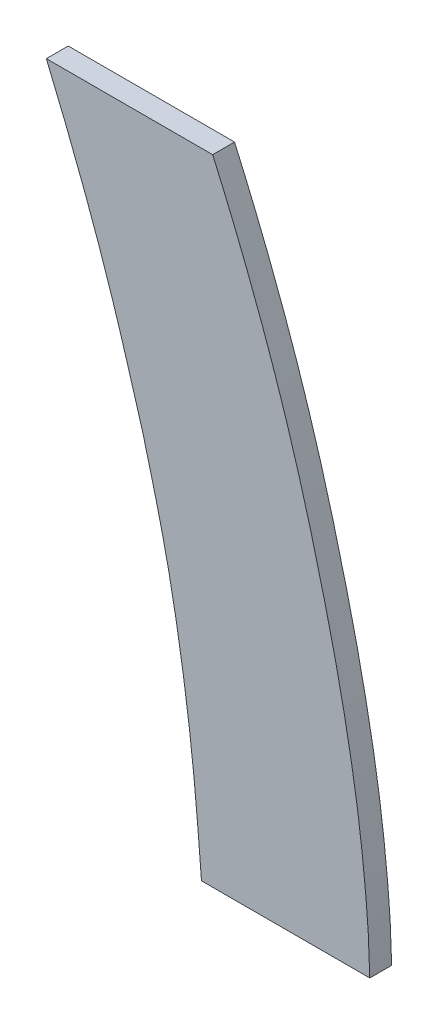
ISO-10303-21;
HEADER;
FILE_DESCRIPTION(('STEP AP214'),'2;1');
FILE_NAME('part.step','',(''),(''),'','','');
FILE_SCHEMA(('AUTOMOTIVE_DESIGN { 1 0 10303 214 1 1 1 1 }'));
ENDSEC;
DATA;
#1=APPLICATION_CONTEXT('core data for automotive mechanical design processes');
#2=APPLICATION_PROTOCOL_DEFINITION('international standard','automotive_design',2000,#1);
#3=PRODUCT_CONTEXT('',#1,'mechanical');
#4=PRODUCT('Part','Part','',(#3));
#5=PRODUCT_RELATED_PRODUCT_CATEGORY('part','',(#4));
#6=PRODUCT_DEFINITION_FORMATION('','',#4);
#7=PRODUCT_DEFINITION_CONTEXT('part definition',#1,'design');
#8=PRODUCT_DEFINITION('design','',#6,#7);
#9=PRODUCT_DEFINITION_SHAPE('','',#8);
#10=(LENGTH_UNIT() NAMED_UNIT(*) SI_UNIT(.MILLI.,.METRE.));
#11=(NAMED_UNIT(*) PLANE_ANGLE_UNIT() SI_UNIT($,.RADIAN.));
#12=(NAMED_UNIT(*) SI_UNIT($,.STERADIAN.) SOLID_ANGLE_UNIT());
#13=UNCERTAINTY_MEASURE_WITH_UNIT(LENGTH_MEASURE(1.E-05),#10,'distance_accuracy_value','');
#14=(GEOMETRIC_REPRESENTATION_CONTEXT(3) GLOBAL_UNCERTAINTY_ASSIGNED_CONTEXT((#13)) GLOBAL_UNIT_ASSIGNED_CONTEXT((#10,
#11,#12)) REPRESENTATION_CONTEXT('',''));
#15=CARTESIAN_POINT('',(0.,0.,0.));
#16=DIRECTION('',(0.,0.,1.));
#17=DIRECTION('',(1.,0.,0.));
#18=AXIS2_PLACEMENT_3D('',#15,#16,#17);
#19=CARTESIAN_POINT('',(1.15384615384617,-15.,0.5));
#20=DIRECTION('',(0.,1.,0.));
#21=DIRECTION('',(0.,0.,1.));
#22=AXIS2_PLACEMENT_3D('',#19,#20,#21);
#23=PLANE('',#22);
#24=DIRECTION('',(1.,0.,0.));
#25=VECTOR('',#24,1.);
#26=CARTESIAN_POINT('',(1.15384615384617,-15.,0.));
#27=LINE('',#26,#25);
#28=CARTESIAN_POINT('',(1.15384615384617,-15.,0.));
#29=VERTEX_POINT('',#28);
#30=CARTESIAN_POINT('',(5.00000000000002,-15.,0.));
#31=VERTEX_POINT('',#30);
#32=EDGE_CURVE('E95',#29,#31,#27,.T.);
#33=ORIENTED_EDGE('',*,*,#32,.T.);
#34=DIRECTION('',(0.,0.,-1.));
#35=VECTOR('',#34,1.);
#36=CARTESIAN_POINT('',(5.00000000000002,-15.,0.5));
#37=LINE('',#36,#35);
#38=CARTESIAN_POINT('',(5.00000000000002,-15.,0.5));
#39=VERTEX_POINT('',#38);
#40=EDGE_CURVE('E94',#39,#31,#37,.T.);
#41=ORIENTED_EDGE('',*,*,#40,.F.);
#42=DIRECTION('',(1.,0.,0.));
#43=VECTOR('',#42,1.);
#44=CARTESIAN_POINT('',(1.15384615384617,-15.,0.5));
#45=LINE('',#44,#43);
#46=CARTESIAN_POINT('',(1.15384615384617,-15.,0.5));
#47=VERTEX_POINT('',#46);
#48=EDGE_CURVE('E145',#47,#39,#45,.T.);
#49=ORIENTED_EDGE('',*,*,#48,.F.);
#50=DIRECTION('',(0.,0.,-1.));
#51=VECTOR('',#50,1.);
#52=CARTESIAN_POINT('',(1.15384615384617,-15.,0.5));
#53=LINE('',#52,#51);
#54=EDGE_CURVE('E100',#47,#29,#53,.T.);
#55=ORIENTED_EDGE('',*,*,#54,.T.);
#56=EDGE_LOOP('',(#33,#41,#49,#55));
#57=FACE_BOUND('',#56,.T.);
#58=ADVANCED_FACE('F39',(#57),#23,.F.);
#59=CARTESIAN_POINT('',(-0.174278846153829,-6.84495192307692,0.5));
#60=CARTESIAN_POINT('',(-0.00832928136429848,-7.47820090477207,0.5));
#61=CARTESIAN_POINT('',(0.329273760221203,-8.76646449601646,0.5));
#62=CARTESIAN_POINT('',(0.698845110705702,-10.7669747186921,0.5));
#63=CARTESIAN_POINT('',(0.984578563524244,-12.8528079495376,0.5));
#64=CARTESIAN_POINT('',(1.09678082774382,-14.2761153252611,0.5));
#65=CARTESIAN_POINT('',(1.15384615384617,-15.,0.5));
#66=B_SPLINE_CURVE_WITH_KNOTS('',3,(#59,#60,#61,#62,#63,#64,#65),.UNSPECIFIED.,.F.,.F.,(4,1,1,1,
4),(0.,0.23721651860421,0.482586491243136,0.736846927177931,1.),.UNSPECIFIED.);
#67=DIRECTION('',(0.,0.,-1.));
#68=VECTOR('',#67,1.);
#69=SURFACE_OF_LINEAR_EXTRUSION('',#66,#68);
#70=CARTESIAN_POINT('',(-0.174278846153829,-6.84495192307692,0.));
#71=CARTESIAN_POINT('',(-0.00832928136429848,-7.47820090477207,0.));
#72=CARTESIAN_POINT('',(0.329273760221203,-8.76646449601646,0.));
#73=CARTESIAN_POINT('',(0.698845110705702,-10.7669747186921,0.));
#74=CARTESIAN_POINT('',(0.984578563524244,-12.8528079495376,0.));
#75=CARTESIAN_POINT('',(1.09678082774382,-14.2761153252611,0.));
#76=CARTESIAN_POINT('',(1.15384615384617,-15.,0.));
#77=B_SPLINE_CURVE_WITH_KNOTS('',3,(#70,#71,#72,#73,#74,#75,#76),.UNSPECIFIED.,.F.,.F.,(4,1,1,1,
4),(0.,0.23721651860421,0.482586491243136,0.736846927177931,1.),.UNSPECIFIED.);
#78=CARTESIAN_POINT('',(-0.174278846153829,-6.84495192307692,0.));
#79=VERTEX_POINT('',#78);
#80=EDGE_CURVE('E86',#79,#29,#77,.T.);
#81=ORIENTED_EDGE('',*,*,#80,.T.);
#82=ORIENTED_EDGE('',*,*,#54,.F.);
#83=CARTESIAN_POINT('',(-0.174278846153829,-6.84495192307692,0.5));
#84=VERTEX_POINT('',#83);
#85=EDGE_CURVE('E115',#84,#47,#66,.T.);
#86=ORIENTED_EDGE('',*,*,#85,.F.);
#87=DIRECTION('',(0.,0.,-1.));
#88=VECTOR('',#87,1.);
#89=CARTESIAN_POINT('',(-0.174278846153829,-6.84495192307692,0.5));
#90=LINE('',#89,#88);
#91=EDGE_CURVE('E47',#84,#79,#90,.T.);
#92=ORIENTED_EDGE('',*,*,#91,.T.);
#93=EDGE_LOOP('',(#81,#82,#86,#92));
#94=FACE_BOUND('',#93,.T.);
#95=ADVANCED_FACE('F122',(#94),#69,.F.);
#96=CARTESIAN_POINT('',(-3.95049273409952,2.81861389838005,0.5));
#97=DIRECTION('',(0.,0.,1.));
#98=DIRECTION('',(1.,0.,0.));
#99=AXIS2_PLACEMENT_3D('',#96,#97,#98);
#100=PLANE('',#99);
#101=DIRECTION('',(1.,0.,0.));
#102=VECTOR('',#101,1.);
#103=CARTESIAN_POINT('',(-3.95049273409952,-0.5,0.5));
#104=LINE('',#103,#102);
#105=CARTESIAN_POINT('',(-2.3913306629247,-0.500000000001907,0.5));
#106=VERTEX_POINT('',#105);
#107=CARTESIAN_POINT('',(1.40940715828724,-0.5,0.5));
#108=VERTEX_POINT('',#107);
#109=EDGE_CURVE('E74',#106,#108,#104,.T.);
#110=ORIENTED_EDGE('',*,*,#109,.F.);
#111=CARTESIAN_POINT('',(-9.6153846153846,11.5024038461538,0.5));
#112=CARTESIAN_POINT('',(-9.3889882736424,11.2376522562014,0.5));
#113=CARTESIAN_POINT('',(-8.92608728055129,10.6963282534886,0.5));
#114=CARTESIAN_POINT('',(-8.25548066497366,9.83408603599883,0.5));
#115=CARTESIAN_POINT('',(-7.58138944532267,8.91609230107851,0.5));
#116=CARTESIAN_POINT('',(-6.9156621712902,7.93351961209931,0.5));
#117=CARTESIAN_POINT('',(-6.24835155024634,6.89353876319968,0.5));
#118=CARTESIAN_POINT('',(-5.5821432756538,5.79282828697568,0.5));
#119=CARTESIAN_POINT('',(-4.91431765251822,4.63406915861775,0.5));
#120=CARTESIAN_POINT('',(-4.03833035758797,3.01158053099116,0.5));
#121=CARTESIAN_POINT('',(-2.99323232642266,0.934386038558628,0.5));
#122=CARTESIAN_POINT('',(-1.90727624655536,-1.6250913851388,0.5));
#123=CARTESIAN_POINT('',(-0.943198230433538,-4.21007935595809,0.5));
#124=CARTESIAN_POINT('',(-0.430159665560484,-5.96811962402121,0.5));
#125=CARTESIAN_POINT('',(-0.174278846153829,-6.84495192307692,0.5));
#126=B_SPLINE_CURVE_WITH_KNOTS('',3,(#111,#112,#113,#114,#115,#116,#117,#118,#119,#120,#121,
#122,#123,#124,#125),.UNSPECIFIED.,.F.,.F.,(4,1,1,1,1,1,1,1,1,1,1,1,4),(0.,0.0502734726151882,
0.102791592039982,0.157614974931026,0.21463366483612,0.274064470748065,0.335948475214225,
0.400322064136752,0.467079328402037,0.602073356450051,0.7357483921365,0.868203050259254,1.),.UNSPECIFIED.);
#127=EDGE_CURVE('E108',#106,#84,#126,.T.);
#128=ORIENTED_EDGE('',*,*,#127,.T.);
#129=ORIENTED_EDGE('',*,*,#85,.T.);
#130=ORIENTED_EDGE('',*,*,#48,.T.);
#131=CARTESIAN_POINT('',(5.00000000000002,-15.,0.5));
#132=CARTESIAN_POINT('',(4.99077477249062,-14.7013651948623,0.5));
#133=CARTESIAN_POINT('',(4.97180363540864,-14.0872403052648,0.5));
#134=CARTESIAN_POINT('',(4.88791171104833,-13.1435720498954,0.5));
#135=CARTESIAN_POINT('',(4.77617535121427,-12.1530107653034,0.5));
#136=CARTESIAN_POINT('',(4.61835722386701,-11.1189027948977,0.5));
#137=CARTESIAN_POINT('',(4.41775741449406,-10.0391490017902,0.5));
#138=CARTESIAN_POINT('',(4.17871649303776,-8.91260570880092,0.5));
#139=CARTESIAN_POINT('',(3.89323169747081,-7.74160284995349,0.5));
#140=CARTESIAN_POINT('',(3.47101596671221,-6.11808420209938,0.5));
#141=CARTESIAN_POINT('',(2.84395697052078,-4.07664347203007,0.5));
#142=CARTESIAN_POINT('',(1.93100448110088,-1.66282701999771,0.5));
#143=CARTESIAN_POINT('',(0.881084437999897,0.709568284264685,0.5));
#144=CARTESIAN_POINT('',(-0.120982865143056,2.63345519191569,0.5));
#145=CARTESIAN_POINT('',(-0.975501110873675,4.13162478775536,0.5));
#146=CARTESIAN_POINT('',(-1.62396200729946,5.21866236523238,0.5));
#147=CARTESIAN_POINT('',(-2.29086299188346,6.25448879588679,0.5));
#148=CARTESIAN_POINT('',(-2.96384029314396,7.24655553228087,0.5));
#149=CARTESIAN_POINT('',(-3.64301055108902,8.19569803809813,0.5));
#150=CARTESIAN_POINT('',(-4.34220880125551,9.09304439301213,0.5));
#151=CARTESIAN_POINT('',(-5.04082027618084,9.95662220214234,0.5));
#152=CARTESIAN_POINT('',(-5.52856856197223,10.5007500523017,0.5));
#153=CARTESIAN_POINT('',(-5.76923076923075,10.7692307692308,0.5));
#154=B_SPLINE_CURVE_WITH_KNOTS('',3,(#131,#132,#133,#134,#135,#136,#137,#138,#139,#140,#141,
#142,#143,#144,#145,#146,#147,#148,#149,#150,#151,#152,#153),.UNSPECIFIED.,.F.,.F.,(4,1,1,1,1,1,
1,1,1,1,1,1,1,1,1,1,1,1,1,1,4),(0.,0.0315156437386742,0.0648100653327354,0.0999121128959951,
0.136676095020003,0.175144023715208,0.215765905895984,0.2581579823942,0.30229429684818,
0.392742479500207,0.483300472378782,0.574413865251515,0.666292469849835,0.712009554638809,
0.756373487942463,0.799814650688496,0.841961044395734,0.882842690062067,0.922917712140965,
0.961966460821911,1.),.UNSPECIFIED.);
#155=EDGE_CURVE('E107',#39,#108,#154,.T.);
#156=ORIENTED_EDGE('',*,*,#155,.T.);
#157=EDGE_LOOP('',(#110,#128,#129,#130,#156));
#158=FACE_BOUND('',#157,.T.);
#159=ADVANCED_FACE('F152',(#158),#100,.T.);
#160=DIRECTION('',(0.,0.,-1.));
#161=VECTOR('',#160,1.);
#162=SURFACE_OF_LINEAR_EXTRUSION('',#154,#161);
#163=CARTESIAN_POINT('',(5.00000000000002,-15.,0.));
#164=CARTESIAN_POINT('',(4.99077477249062,-14.7013651948623,0.));
#165=CARTESIAN_POINT('',(4.97180363540864,-14.0872403052648,0.));
#166=CARTESIAN_POINT('',(4.88791171104833,-13.1435720498954,0.));
#167=CARTESIAN_POINT('',(4.77617535121427,-12.1530107653034,0.));
#168=CARTESIAN_POINT('',(4.61835722386701,-11.1189027948977,0.));
#169=CARTESIAN_POINT('',(4.41775741449406,-10.0391490017902,0.));
#170=CARTESIAN_POINT('',(4.17871649303776,-8.91260570880092,0.));
#171=CARTESIAN_POINT('',(3.89323169747081,-7.74160284995349,0.));
#172=CARTESIAN_POINT('',(3.47101596671221,-6.11808420209938,0.));
#173=CARTESIAN_POINT('',(2.84395697052078,-4.07664347203007,0.));
#174=CARTESIAN_POINT('',(1.93100448110088,-1.66282701999771,0.));
#175=CARTESIAN_POINT('',(0.881084437999897,0.709568284264685,0.));
#176=CARTESIAN_POINT('',(-0.120982865143056,2.63345519191569,0.));
#177=CARTESIAN_POINT('',(-0.975501110873675,4.13162478775536,0.));
#178=CARTESIAN_POINT('',(-1.62396200729946,5.21866236523238,0.));
#179=CARTESIAN_POINT('',(-2.29086299188346,6.25448879588679,0.));
#180=CARTESIAN_POINT('',(-2.96384029314396,7.24655553228087,0.));
#181=CARTESIAN_POINT('',(-3.64301055108902,8.19569803809813,0.));
#182=CARTESIAN_POINT('',(-4.34220880125551,9.09304439301213,0.));
#183=CARTESIAN_POINT('',(-5.04082027618084,9.95662220214234,0.));
#184=CARTESIAN_POINT('',(-5.52856856197223,10.5007500523017,0.));
#185=CARTESIAN_POINT('',(-5.76923076923075,10.7692307692308,0.));
#186=B_SPLINE_CURVE_WITH_KNOTS('',3,(#163,#164,#165,#166,#167,#168,#169,#170,#171,#172,#173,
#174,#175,#176,#177,#178,#179,#180,#181,#182,#183,#184,#185),.UNSPECIFIED.,.F.,.F.,(4,1,1,1,1,1,
1,1,1,1,1,1,1,1,1,1,1,1,1,1,4),(0.,0.0315156437386742,0.0648100653327354,0.0999121128959951,
0.136676095020003,0.175144023715208,0.215765905895984,0.2581579823942,0.30229429684818,
0.392742479500207,0.483300472378782,0.574413865251515,0.666292469849835,0.712009554638809,
0.756373487942463,0.799814650688496,0.841961044395734,0.882842690062067,0.922917712140965,
0.961966460821911,1.),.UNSPECIFIED.);
#187=CARTESIAN_POINT('',(1.40940715181599,-0.499999995134114,0.));
#188=VERTEX_POINT('',#187);
#189=EDGE_CURVE('E99',#31,#188,#186,.T.);
#190=ORIENTED_EDGE('',*,*,#189,.T.);
#191=DIRECTION('',(0.,0.,-1.));
#192=VECTOR('',#191,1.);
#193=CARTESIAN_POINT('',(1.40940715397309,-0.499999999999999,0.5));
#194=LINE('',#193,#192);
#195=EDGE_CURVE('E70',#188,#108,#194,.F.);
#196=ORIENTED_EDGE('',*,*,#195,.T.);
#197=ORIENTED_EDGE('',*,*,#155,.F.);
#198=ORIENTED_EDGE('',*,*,#40,.T.);
#199=EDGE_LOOP('',(#190,#196,#197,#198));
#200=FACE_BOUND('',#199,.T.);
#201=ADVANCED_FACE('F101',(#200),#162,.F.);
#202=DIRECTION('',(0.,0.,-1.));
#203=VECTOR('',#202,1.);
#204=SURFACE_OF_LINEAR_EXTRUSION('',#126,#203);
#205=ORIENTED_EDGE('',*,*,#127,.F.);
#206=DIRECTION('',(0.,0.,-1.));
#207=VECTOR('',#206,1.);
#208=CARTESIAN_POINT('',(-2.39133066292551,-0.499999999999999,0.5));
#209=LINE('',#208,#207);
#210=CARTESIAN_POINT('',(-2.3913306628462,-0.499999999999999,0.));
#211=VERTEX_POINT('',#210);
#212=EDGE_CURVE('E57',#106,#211,#209,.T.);
#213=ORIENTED_EDGE('',*,*,#212,.T.);
#214=CARTESIAN_POINT('',(-9.6153846153846,11.5024038461538,0.));
#215=CARTESIAN_POINT('',(-9.3889882736424,11.2376522562014,0.));
#216=CARTESIAN_POINT('',(-8.92608728055129,10.6963282534886,0.));
#217=CARTESIAN_POINT('',(-8.25548066497366,9.83408603599883,0.));
#218=CARTESIAN_POINT('',(-7.58138944532267,8.91609230107851,0.));
#219=CARTESIAN_POINT('',(-6.9156621712902,7.93351961209931,0.));
#220=CARTESIAN_POINT('',(-6.24835155024634,6.89353876319968,0.));
#221=CARTESIAN_POINT('',(-5.5821432756538,5.79282828697568,0.));
#222=CARTESIAN_POINT('',(-4.91431765251822,4.63406915861775,0.));
#223=CARTESIAN_POINT('',(-4.03833035758797,3.01158053099116,0.));
#224=CARTESIAN_POINT('',(-2.99323232642266,0.934386038558628,0.));
#225=CARTESIAN_POINT('',(-1.90727624655536,-1.6250913851388,0.));
#226=CARTESIAN_POINT('',(-0.943198230433538,-4.21007935595809,0.));
#227=CARTESIAN_POINT('',(-0.430159665560484,-5.96811962402121,0.));
#228=CARTESIAN_POINT('',(-0.174278846153829,-6.84495192307692,0.));
#229=B_SPLINE_CURVE_WITH_KNOTS('',3,(#214,#215,#216,#217,#218,#219,#220,#221,#222,#223,#224,
#225,#226,#227,#228),.UNSPECIFIED.,.F.,.F.,(4,1,1,1,1,1,1,1,1,1,1,1,4),(0.,0.0502734726151882,
0.102791592039982,0.157614974931026,0.21463366483612,0.274064470748065,0.335948475214225,
0.400322064136752,0.467079328402037,0.602073356450051,0.7357483921365,0.868203050259254,1.),.UNSPECIFIED.);
#230=EDGE_CURVE('E124',#211,#79,#229,.T.);
#231=ORIENTED_EDGE('',*,*,#230,.T.);
#232=ORIENTED_EDGE('',*,*,#91,.F.);
#233=EDGE_LOOP('',(#205,#213,#231,#232));
#234=FACE_BOUND('',#233,.T.);
#235=ADVANCED_FACE('F41',(#234),#204,.F.);
#236=CARTESIAN_POINT('',(-3.95049273409952,2.81861389838005,0.));
#237=DIRECTION('',(0.,0.,1.));
#238=DIRECTION('',(1.,0.,0.));
#239=AXIS2_PLACEMENT_3D('',#236,#237,#238);
#240=PLANE('',#239);
#241=DIRECTION('',(-1.,0.,0.));
#242=VECTOR('',#241,1.);
#243=CARTESIAN_POINT('',(-17.,-0.5,0.));
#244=LINE('',#243,#242);
#245=EDGE_CURVE('E11',#188,#211,#244,.T.);
#246=ORIENTED_EDGE('',*,*,#245,.F.);
#247=ORIENTED_EDGE('',*,*,#189,.F.);
#248=ORIENTED_EDGE('',*,*,#32,.F.);
#249=ORIENTED_EDGE('',*,*,#80,.F.);
#250=ORIENTED_EDGE('',*,*,#230,.F.);
#251=EDGE_LOOP('',(#246,#247,#248,#249,#250));
#252=FACE_BOUND('',#251,.T.);
#253=ADVANCED_FACE('F110',(#252),#240,.F.);
#254=CARTESIAN_POINT('',(-17.,-0.5,1.));
#255=DIRECTION('',(0.,-1.,0.));
#256=DIRECTION('',(0.,0.,-1.));
#257=AXIS2_PLACEMENT_3D('',#254,#255,#256);
#258=PLANE('',#257);
#259=ORIENTED_EDGE('',*,*,#109,.T.);
#260=ORIENTED_EDGE('',*,*,#195,.F.);
#261=ORIENTED_EDGE('',*,*,#245,.T.);
#262=ORIENTED_EDGE('',*,*,#212,.F.);
#263=EDGE_LOOP('',(#259,#260,#261,#262));
#264=FACE_BOUND('',#263,.T.);
#265=ADVANCED_FACE('F180',(#264),#258,.F.);
#266=CLOSED_SHELL('',(#58,#95,#159,#201,#235,#253,#265));
#267=MANIFOLD_SOLID_BREP('B2',#266);
#268=ADVANCED_BREP_SHAPE_REPRESENTATION('',(#18,#267),#14);
#269=SHAPE_DEFINITION_REPRESENTATION(#9,#268);
ENDSEC;
END-ISO-10303-21;
